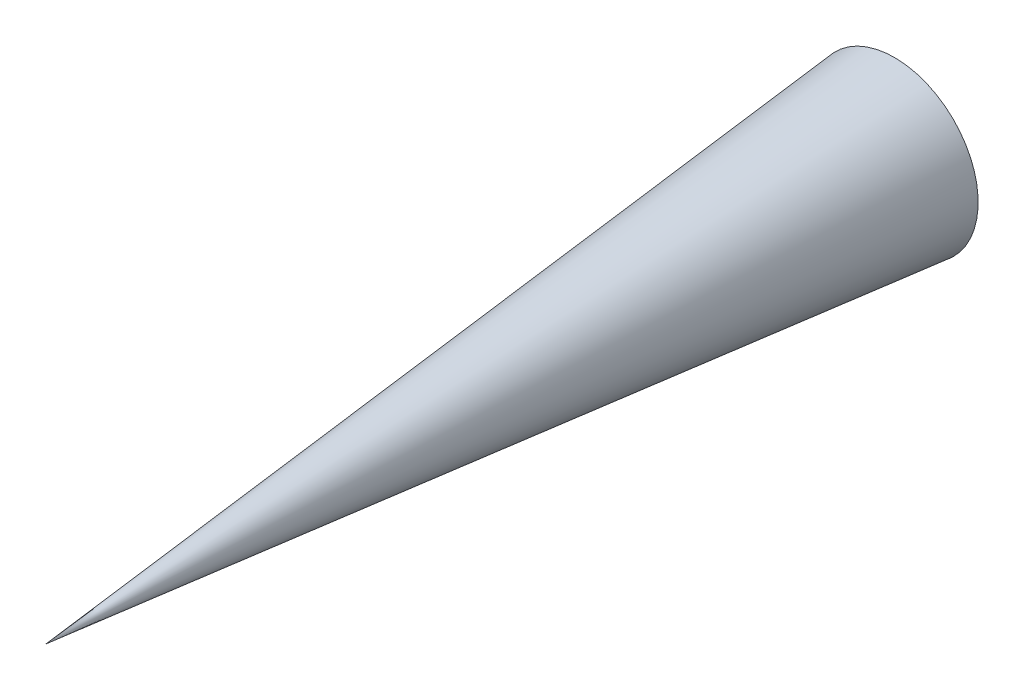
ISO-10303-21;
HEADER;
FILE_DESCRIPTION(('STEP AP214'),'2;1');
FILE_NAME('part.step','',(''),(''),'','','');
FILE_SCHEMA(('AUTOMOTIVE_DESIGN { 1 0 10303 214 1 1 1 1 }'));
ENDSEC;
DATA;
#1=APPLICATION_CONTEXT('core data for automotive mechanical design processes');
#2=APPLICATION_PROTOCOL_DEFINITION('international standard','automotive_design',2000,#1);
#3=PRODUCT_CONTEXT('',#1,'mechanical');
#4=PRODUCT('Part','Part','',(#3));
#5=PRODUCT_RELATED_PRODUCT_CATEGORY('part','',(#4));
#6=PRODUCT_DEFINITION_FORMATION('','',#4);
#7=PRODUCT_DEFINITION_CONTEXT('part definition',#1,'design');
#8=PRODUCT_DEFINITION('design','',#6,#7);
#9=PRODUCT_DEFINITION_SHAPE('','',#8);
#10=(LENGTH_UNIT() NAMED_UNIT(*) SI_UNIT(.MILLI.,.METRE.));
#11=(NAMED_UNIT(*) PLANE_ANGLE_UNIT() SI_UNIT($,.RADIAN.));
#12=(NAMED_UNIT(*) SI_UNIT($,.STERADIAN.) SOLID_ANGLE_UNIT());
#13=UNCERTAINTY_MEASURE_WITH_UNIT(LENGTH_MEASURE(1.E-05),#10,'distance_accuracy_value','');
#14=(GEOMETRIC_REPRESENTATION_CONTEXT(3) GLOBAL_UNCERTAINTY_ASSIGNED_CONTEXT((#13)) GLOBAL_UNIT_ASSIGNED_CONTEXT((#10,
#11,#12)) REPRESENTATION_CONTEXT('',''));
#15=CARTESIAN_POINT('',(0.,0.,0.));
#16=DIRECTION('',(0.,0.,1.));
#17=DIRECTION('',(1.,0.,0.));
#18=AXIS2_PLACEMENT_3D('',#15,#16,#17);
#19=CARTESIAN_POINT('',(0.,0.,0.));
#20=DIRECTION('',(0.,0.,-1.));
#21=DIRECTION('',(-1.,0.,0.));
#22=AXIS2_PLACEMENT_3D('',#19,#20,#21);
#23=PLANE('',#22);
#24=CARTESIAN_POINT('',(0.,0.,0.));
#25=DIRECTION('',(0.,0.,-1.));
#26=DIRECTION('',(-1.,0.,0.));
#27=AXIS2_PLACEMENT_3D('',#24,#25,#26);
#28=CIRCLE('',#27,50.8);
#29=CARTESIAN_POINT('',(-50.8,0.,0.));
#30=VERTEX_POINT('',#29);
#31=EDGE_CURVE('E11',#30,#30,#28,.T.);
#32=ORIENTED_EDGE('',*,*,#31,.T.);
#33=EDGE_LOOP('',(#32));
#34=FACE_BOUND('',#33,.T.);
#35=ADVANCED_FACE('F43',(#34),#23,.T.);
#36=CARTESIAN_POINT('',(0.,0.,0.));
#37=DIRECTION('',(0.,0.,-1.));
#38=DIRECTION('',(-1.,0.,0.));
#39=AXIS2_PLACEMENT_3D('',#36,#37,#38);
#40=CONICAL_SURFACE('',#39,50.8,0.0982403234975697);
#41=CARTESIAN_POINT('',(0.,-2.70131694790618E-12,515.434666959943));
#42=VERTEX_POINT('',#41);
#43=VERTEX_LOOP('',#42);
#44=FACE_BOUND('',#43,.T.);
#45=ORIENTED_EDGE('',*,*,#31,.F.);
#46=EDGE_LOOP('',(#45));
#47=FACE_BOUND('',#46,.T.);
#48=ADVANCED_FACE('F50',(#44,#47),#40,.T.);
#49=CLOSED_SHELL('',(#35,#48));
#50=MANIFOLD_SOLID_BREP('B2',#49);
#51=ADVANCED_BREP_SHAPE_REPRESENTATION('',(#18,#50),#14);
#52=SHAPE_DEFINITION_REPRESENTATION(#9,#51);
ENDSEC;
END-ISO-10303-21;
